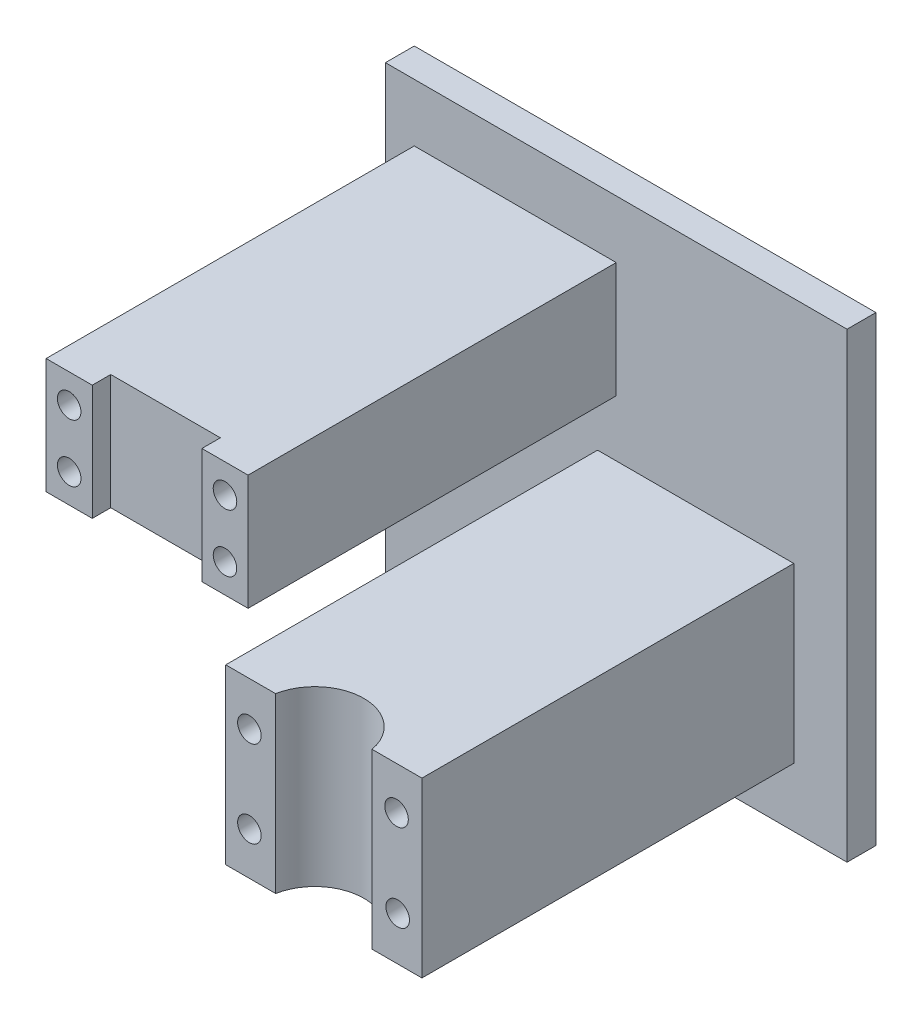
ISO-10303-21;
HEADER;
FILE_DESCRIPTION(('STEP AP214'),'2;1');
FILE_NAME('part.step','',(''),(''),'','','');
FILE_SCHEMA(('AUTOMOTIVE_DESIGN { 1 0 10303 214 1 1 1 1 }'));
ENDSEC;
DATA;
#1=APPLICATION_CONTEXT('core data for automotive mechanical design processes');
#2=APPLICATION_PROTOCOL_DEFINITION('international standard','automotive_design',2000,#1);
#3=PRODUCT_CONTEXT('',#1,'mechanical');
#4=PRODUCT('Part','Part','',(#3));
#5=PRODUCT_RELATED_PRODUCT_CATEGORY('part','',(#4));
#6=PRODUCT_DEFINITION_FORMATION('','',#4);
#7=PRODUCT_DEFINITION_CONTEXT('part definition',#1,'design');
#8=PRODUCT_DEFINITION('design','',#6,#7);
#9=PRODUCT_DEFINITION_SHAPE('','',#8);
#10=(LENGTH_UNIT() NAMED_UNIT(*) SI_UNIT(.MILLI.,.METRE.));
#11=(NAMED_UNIT(*) PLANE_ANGLE_UNIT() SI_UNIT($,.RADIAN.));
#12=(NAMED_UNIT(*) SI_UNIT($,.STERADIAN.) SOLID_ANGLE_UNIT());
#13=UNCERTAINTY_MEASURE_WITH_UNIT(LENGTH_MEASURE(1.E-05),#10,'distance_accuracy_value','');
#14=(GEOMETRIC_REPRESENTATION_CONTEXT(3) GLOBAL_UNCERTAINTY_ASSIGNED_CONTEXT((#13)) GLOBAL_UNIT_ASSIGNED_CONTEXT((#10,
#11,#12)) REPRESENTATION_CONTEXT('',''));
#15=CARTESIAN_POINT('',(0.,0.,0.));
#16=DIRECTION('',(0.,0.,1.));
#17=DIRECTION('',(1.,0.,0.));
#18=AXIS2_PLACEMENT_3D('',#15,#16,#17);
#19=CARTESIAN_POINT('',(0.,0.,6.35));
#20=DIRECTION('',(0.,0.,1.));
#21=DIRECTION('',(1.,0.,0.));
#22=AXIS2_PLACEMENT_3D('',#19,#20,#21);
#23=PLANE('',#22);
#24=DIRECTION('',(0.,1.,0.));
#25=VECTOR('',#24,1.);
#26=CARTESIAN_POINT('',(0.,0.,6.35));
#27=LINE('',#26,#25);
#28=CARTESIAN_POINT('',(0.,0.,6.35));
#29=VERTEX_POINT('',#28);
#30=CARTESIAN_POINT('',(0.,101.6,6.35));
#31=VERTEX_POINT('',#30);
#32=EDGE_CURVE('E212',#29,#31,#27,.T.);
#33=ORIENTED_EDGE('',*,*,#32,.T.);
#34=DIRECTION('',(-1.,0.,0.));
#35=VECTOR('',#34,1.);
#36=CARTESIAN_POINT('',(0.,101.6,6.35));
#37=LINE('',#36,#35);
#38=CARTESIAN_POINT('',(-101.6,101.6,6.35));
#39=VERTEX_POINT('',#38);
#40=EDGE_CURVE('E215',#31,#39,#37,.T.);
#41=ORIENTED_EDGE('',*,*,#40,.T.);
#42=DIRECTION('',(0.,-1.,0.));
#43=VECTOR('',#42,1.);
#44=CARTESIAN_POINT('',(-101.6,0.,6.35));
#45=LINE('',#44,#43);
#46=CARTESIAN_POINT('',(-101.6,0.,6.35));
#47=VERTEX_POINT('',#46);
#48=EDGE_CURVE('E218',#39,#47,#45,.T.);
#49=ORIENTED_EDGE('',*,*,#48,.T.);
#50=DIRECTION('',(1.,0.,0.));
#51=VECTOR('',#50,1.);
#52=CARTESIAN_POINT('',(0.,0.,6.35));
#53=LINE('',#52,#51);
#54=EDGE_CURVE('E220',#47,#29,#53,.T.);
#55=ORIENTED_EDGE('',*,*,#54,.T.);
#56=EDGE_LOOP('',(#33,#41,#49,#55));
#57=FACE_BOUND('',#56,.T.);
#58=DIRECTION('',(1.,0.,0.));
#59=VECTOR('',#58,1.);
#60=CARTESIAN_POINT('',(-95.25,63.5,6.35));
#61=LINE('',#60,#59);
#62=CARTESIAN_POINT('',(-95.25,63.5,6.35));
#63=VERTEX_POINT('',#62);
#64=CARTESIAN_POINT('',(-50.8,63.5,6.35));
#65=VERTEX_POINT('',#64);
#66=EDGE_CURVE('E354',#63,#65,#61,.T.);
#67=ORIENTED_EDGE('',*,*,#66,.F.);
#68=DIRECTION('',(0.,-1.,0.));
#69=VECTOR('',#68,1.);
#70=CARTESIAN_POINT('',(-95.25,88.9,6.35));
#71=LINE('',#70,#69);
#72=CARTESIAN_POINT('',(-95.25,88.9,6.35));
#73=VERTEX_POINT('',#72);
#74=EDGE_CURVE('E200',#73,#63,#71,.T.);
#75=ORIENTED_EDGE('',*,*,#74,.F.);
#76=DIRECTION('',(-1.,0.,0.));
#77=VECTOR('',#76,1.);
#78=CARTESIAN_POINT('',(-95.25,88.9,6.35));
#79=LINE('',#78,#77);
#80=CARTESIAN_POINT('',(-50.8,88.9,6.35));
#81=VERTEX_POINT('',#80);
#82=EDGE_CURVE('E359',#81,#73,#79,.T.);
#83=ORIENTED_EDGE('',*,*,#82,.F.);
#84=DIRECTION('',(0.,1.,0.));
#85=VECTOR('',#84,1.);
#86=CARTESIAN_POINT('',(-50.8,88.9,6.35));
#87=LINE('',#86,#85);
#88=EDGE_CURVE('E356',#65,#81,#87,.T.);
#89=ORIENTED_EDGE('',*,*,#88,.F.);
#90=EDGE_LOOP('',(#67,#75,#83,#89));
#91=FACE_BOUND('',#90,.T.);
#92=DIRECTION('',(1.,0.,0.));
#93=VECTOR('',#92,1.);
#94=CARTESIAN_POINT('',(-54.9059993594507,12.991507512595,6.35));
#95=LINE('',#94,#93);
#96=CARTESIAN_POINT('',(-54.9059993594507,12.991507512595,6.35));
#97=VERTEX_POINT('',#96);
#98=CARTESIAN_POINT('',(-11.7259993594507,12.991507512595,6.35));
#99=VERTEX_POINT('',#98);
#100=EDGE_CURVE('E328',#97,#99,#95,.T.);
#101=ORIENTED_EDGE('',*,*,#100,.F.);
#102=DIRECTION('',(0.,-1.,0.));
#103=VECTOR('',#102,1.);
#104=CARTESIAN_POINT('',(-54.9059993594507,12.991507512595,6.35));
#105=LINE('',#104,#103);
#106=CARTESIAN_POINT('',(-54.9059993594507,51.091507512595,6.35));
#107=VERTEX_POINT('',#106);
#108=EDGE_CURVE('E325',#107,#97,#105,.T.);
#109=ORIENTED_EDGE('',*,*,#108,.F.);
#110=DIRECTION('',(-1.,0.,0.));
#111=VECTOR('',#110,1.);
#112=CARTESIAN_POINT('',(-54.9059993594507,51.091507512595,6.35));
#113=LINE('',#112,#111);
#114=CARTESIAN_POINT('',(-11.7259993594507,51.091507512595,6.35));
#115=VERTEX_POINT('',#114);
#116=EDGE_CURVE('E334',#115,#107,#113,.T.);
#117=ORIENTED_EDGE('',*,*,#116,.F.);
#118=DIRECTION('',(0.,1.,0.));
#119=VECTOR('',#118,1.);
#120=CARTESIAN_POINT('',(-11.7259993594507,12.991507512595,6.35));
#121=LINE('',#120,#119);
#122=EDGE_CURVE('E331',#99,#115,#121,.T.);
#123=ORIENTED_EDGE('',*,*,#122,.F.);
#124=EDGE_LOOP('',(#101,#109,#117,#123));
#125=FACE_BOUND('',#124,.T.);
#126=ADVANCED_FACE('F32',(#57,#91,#125),#23,.T.);
#127=CARTESIAN_POINT('',(0.,0.,6.35));
#128=DIRECTION('',(-1.,0.,0.));
#129=DIRECTION('',(0.,0.,1.));
#130=AXIS2_PLACEMENT_3D('',#127,#128,#129);
#131=PLANE('',#130);
#132=DIRECTION('',(0.,1.,0.));
#133=VECTOR('',#132,1.);
#134=CARTESIAN_POINT('',(0.,0.,0.));
#135=LINE('',#134,#133);
#136=CARTESIAN_POINT('',(0.,0.,0.));
#137=VERTEX_POINT('',#136);
#138=CARTESIAN_POINT('',(0.,101.6,0.));
#139=VERTEX_POINT('',#138);
#140=EDGE_CURVE('E202',#137,#139,#135,.T.);
#141=ORIENTED_EDGE('',*,*,#140,.T.);
#142=DIRECTION('',(0.,0.,-1.));
#143=VECTOR('',#142,1.);
#144=CARTESIAN_POINT('',(0.,101.6,6.35));
#145=LINE('',#144,#143);
#146=EDGE_CURVE('E235',#31,#139,#145,.T.);
#147=ORIENTED_EDGE('',*,*,#146,.F.);
#148=ORIENTED_EDGE('',*,*,#32,.F.);
#149=DIRECTION('',(0.,0.,-1.));
#150=VECTOR('',#149,1.);
#151=CARTESIAN_POINT('',(0.,0.,6.35));
#152=LINE('',#151,#150);
#153=EDGE_CURVE('E221',#29,#137,#152,.T.);
#154=ORIENTED_EDGE('',*,*,#153,.T.);
#155=EDGE_LOOP('',(#141,#147,#148,#154));
#156=FACE_BOUND('',#155,.T.);
#157=ADVANCED_FACE('F34',(#156),#131,.F.);
#158=CARTESIAN_POINT('',(0.,101.6,6.35));
#159=DIRECTION('',(0.,-1.,0.));
#160=DIRECTION('',(1.,0.,0.));
#161=AXIS2_PLACEMENT_3D('',#158,#159,#160);
#162=PLANE('',#161);
#163=DIRECTION('',(-1.,0.,0.));
#164=VECTOR('',#163,1.);
#165=CARTESIAN_POINT('',(0.,101.6,0.));
#166=LINE('',#165,#164);
#167=CARTESIAN_POINT('',(-101.6,101.6,0.));
#168=VERTEX_POINT('',#167);
#169=EDGE_CURVE('E206',#139,#168,#166,.T.);
#170=ORIENTED_EDGE('',*,*,#169,.T.);
#171=DIRECTION('',(0.,0.,-1.));
#172=VECTOR('',#171,1.);
#173=CARTESIAN_POINT('',(-101.6,101.6,6.35));
#174=LINE('',#173,#172);
#175=EDGE_CURVE('E232',#39,#168,#174,.T.);
#176=ORIENTED_EDGE('',*,*,#175,.F.);
#177=ORIENTED_EDGE('',*,*,#40,.F.);
#178=ORIENTED_EDGE('',*,*,#146,.T.);
#179=EDGE_LOOP('',(#170,#176,#177,#178));
#180=FACE_BOUND('',#179,.T.);
#181=ADVANCED_FACE('F416',(#180),#162,.F.);
#182=CARTESIAN_POINT('',(-101.6,0.,6.35));
#183=DIRECTION('',(1.,0.,0.));
#184=DIRECTION('',(0.,0.,-1.));
#185=AXIS2_PLACEMENT_3D('',#182,#183,#184);
#186=PLANE('',#185);
#187=DIRECTION('',(0.,-1.,0.));
#188=VECTOR('',#187,1.);
#189=CARTESIAN_POINT('',(-101.6,0.,0.));
#190=LINE('',#189,#188);
#191=CARTESIAN_POINT('',(-101.6,0.,0.));
#192=VERTEX_POINT('',#191);
#193=EDGE_CURVE('E224',#168,#192,#190,.T.);
#194=ORIENTED_EDGE('',*,*,#193,.T.);
#195=DIRECTION('',(0.,0.,-1.));
#196=VECTOR('',#195,1.);
#197=CARTESIAN_POINT('',(-101.6,0.,6.35));
#198=LINE('',#197,#196);
#199=EDGE_CURVE('E229',#47,#192,#198,.T.);
#200=ORIENTED_EDGE('',*,*,#199,.F.);
#201=ORIENTED_EDGE('',*,*,#48,.F.);
#202=ORIENTED_EDGE('',*,*,#175,.T.);
#203=EDGE_LOOP('',(#194,#200,#201,#202));
#204=FACE_BOUND('',#203,.T.);
#205=ADVANCED_FACE('F428',(#204),#186,.F.);
#206=CARTESIAN_POINT('',(0.,0.,6.35));
#207=DIRECTION('',(0.,1.,0.));
#208=DIRECTION('',(-1.,0.,0.));
#209=AXIS2_PLACEMENT_3D('',#206,#207,#208);
#210=PLANE('',#209);
#211=DIRECTION('',(1.,0.,0.));
#212=VECTOR('',#211,1.);
#213=CARTESIAN_POINT('',(0.,0.,0.));
#214=LINE('',#213,#212);
#215=EDGE_CURVE('E216',#192,#137,#214,.T.);
#216=ORIENTED_EDGE('',*,*,#215,.T.);
#217=ORIENTED_EDGE('',*,*,#153,.F.);
#218=ORIENTED_EDGE('',*,*,#54,.F.);
#219=ORIENTED_EDGE('',*,*,#199,.T.);
#220=EDGE_LOOP('',(#216,#217,#218,#219));
#221=FACE_BOUND('',#220,.T.);
#222=ADVANCED_FACE('F424',(#221),#210,.F.);
#223=CARTESIAN_POINT('',(0.,0.,0.));
#224=DIRECTION('',(0.,0.,1.));
#225=DIRECTION('',(1.,0.,0.));
#226=AXIS2_PLACEMENT_3D('',#223,#224,#225);
#227=PLANE('',#226);
#228=ORIENTED_EDGE('',*,*,#140,.F.);
#229=ORIENTED_EDGE('',*,*,#215,.F.);
#230=ORIENTED_EDGE('',*,*,#193,.F.);
#231=ORIENTED_EDGE('',*,*,#169,.F.);
#232=EDGE_LOOP('',(#228,#229,#230,#231));
#233=FACE_BOUND('',#232,.T.);
#234=ADVANCED_FACE('F421',(#233),#227,.F.);
#235=CARTESIAN_POINT('',(-95.25,88.9,107.95));
#236=DIRECTION('',(1.,0.,0.));
#237=DIRECTION('',(0.,0.,-1.));
#238=AXIS2_PLACEMENT_3D('',#235,#236,#237);
#239=PLANE('',#238);
#240=DIRECTION('',(0.,0.,-1.));
#241=VECTOR('',#240,1.);
#242=CARTESIAN_POINT('',(-95.25,63.5,107.95));
#243=LINE('',#242,#241);
#244=CARTESIAN_POINT('',(-95.25,63.5,87.376));
#245=VERTEX_POINT('',#244);
#246=EDGE_CURVE('E192',#245,#63,#243,.T.);
#247=ORIENTED_EDGE('',*,*,#246,.F.);
#248=DIRECTION('',(0.,1.,0.));
#249=VECTOR('',#248,1.);
#250=CARTESIAN_POINT('',(-95.25,-0.00100000000004263,87.376));
#251=LINE('',#250,#249);
#252=CARTESIAN_POINT('',(-95.25,88.9,87.376));
#253=VERTEX_POINT('',#252);
#254=EDGE_CURVE('E178',#245,#253,#251,.T.);
#255=ORIENTED_EDGE('',*,*,#254,.T.);
#256=DIRECTION('',(0.,0.,-1.));
#257=VECTOR('',#256,1.);
#258=CARTESIAN_POINT('',(-95.25,88.9,107.95));
#259=LINE('',#258,#257);
#260=EDGE_CURVE('E362',#253,#73,#259,.T.);
#261=ORIENTED_EDGE('',*,*,#260,.T.);
#262=ORIENTED_EDGE('',*,*,#74,.T.);
#263=EDGE_LOOP('',(#247,#255,#261,#262));
#264=FACE_BOUND('',#263,.T.);
#265=ADVANCED_FACE('F198',(#264),#239,.F.);
#266=CARTESIAN_POINT('',(-95.25,63.5,107.95));
#267=DIRECTION('',(0.,1.,0.));
#268=DIRECTION('',(0.,0.,1.));
#269=AXIS2_PLACEMENT_3D('',#266,#267,#268);
#270=PLANE('',#269);
#271=DIRECTION('',(0.,0.,-1.));
#272=VECTOR('',#271,1.);
#273=CARTESIAN_POINT('',(-85.09,63.5,95.25));
#274=LINE('',#273,#272);
#275=CARTESIAN_POINT('',(-85.09,63.5,87.376));
#276=VERTEX_POINT('',#275);
#277=CARTESIAN_POINT('',(-85.09,63.5,83.312));
#278=VERTEX_POINT('',#277);
#279=EDGE_CURVE('E195',#276,#278,#274,.T.);
#280=ORIENTED_EDGE('',*,*,#279,.F.);
#281=DIRECTION('',(1.,0.,0.));
#282=VECTOR('',#281,1.);
#283=CARTESIAN_POINT('',(-50.8,63.5,87.376));
#284=LINE('',#283,#282);
#285=EDGE_CURVE('E47',#245,#276,#284,.T.);
#286=ORIENTED_EDGE('',*,*,#285,.F.);
#287=ORIENTED_EDGE('',*,*,#246,.T.);
#288=ORIENTED_EDGE('',*,*,#66,.T.);
#289=DIRECTION('',(0.,0.,-1.));
#290=VECTOR('',#289,1.);
#291=CARTESIAN_POINT('',(-50.8,63.5,107.95));
#292=LINE('',#291,#290);
#293=CARTESIAN_POINT('',(-50.8,63.5,87.376));
#294=VERTEX_POINT('',#293);
#295=EDGE_CURVE('E203',#294,#65,#292,.T.);
#296=ORIENTED_EDGE('',*,*,#295,.F.);
#297=DIRECTION('',(1.,0.,0.));
#298=VECTOR('',#297,1.);
#299=CARTESIAN_POINT('',(-50.8,63.5,87.376));
#300=LINE('',#299,#298);
#301=CARTESIAN_POINT('',(-60.96,63.5,87.376));
#302=VERTEX_POINT('',#301);
#303=EDGE_CURVE('E255',#302,#294,#300,.T.);
#304=ORIENTED_EDGE('',*,*,#303,.F.);
#305=DIRECTION('',(0.,0.,1.));
#306=VECTOR('',#305,1.);
#307=CARTESIAN_POINT('',(-60.96,63.5,95.25));
#308=LINE('',#307,#306);
#309=CARTESIAN_POINT('',(-60.96,63.5,83.312));
#310=VERTEX_POINT('',#309);
#311=EDGE_CURVE('E253',#310,#302,#308,.T.);
#312=ORIENTED_EDGE('',*,*,#311,.F.);
#313=DIRECTION('',(1.,0.,0.));
#314=VECTOR('',#313,1.);
#315=CARTESIAN_POINT('',(-85.09,63.5,83.312));
#316=LINE('',#315,#314);
#317=EDGE_CURVE('E346',#278,#310,#316,.T.);
#318=ORIENTED_EDGE('',*,*,#317,.F.);
#319=EDGE_LOOP('',(#280,#286,#287,#288,#296,#304,#312,#318));
#320=FACE_BOUND('',#319,.T.);
#321=ADVANCED_FACE('F190',(#320),#270,.F.);
#322=CARTESIAN_POINT('',(-50.8,88.9,107.95));
#323=DIRECTION('',(-1.,0.,0.));
#324=DIRECTION('',(0.,0.,1.));
#325=AXIS2_PLACEMENT_3D('',#322,#323,#324);
#326=PLANE('',#325);
#327=DIRECTION('',(0.,0.,-1.));
#328=VECTOR('',#327,1.);
#329=CARTESIAN_POINT('',(-50.8,88.9,107.95));
#330=LINE('',#329,#328);
#331=CARTESIAN_POINT('',(-50.8,88.9,87.376));
#332=VERTEX_POINT('',#331);
#333=EDGE_CURVE('E208',#332,#81,#330,.T.);
#334=ORIENTED_EDGE('',*,*,#333,.F.);
#335=DIRECTION('',(0.,1.,0.));
#336=VECTOR('',#335,1.);
#337=CARTESIAN_POINT('',(-50.8,-0.00100000000002876,87.376));
#338=LINE('',#337,#336);
#339=EDGE_CURVE('E262',#294,#332,#338,.T.);
#340=ORIENTED_EDGE('',*,*,#339,.F.);
#341=ORIENTED_EDGE('',*,*,#295,.T.);
#342=ORIENTED_EDGE('',*,*,#88,.T.);
#343=EDGE_LOOP('',(#334,#340,#341,#342));
#344=FACE_BOUND('',#343,.T.);
#345=ADVANCED_FACE('F367',(#344),#326,.F.);
#346=CARTESIAN_POINT('',(-95.25,88.9,107.95));
#347=DIRECTION('',(0.,-1.,0.));
#348=DIRECTION('',(1.,0.,0.));
#349=AXIS2_PLACEMENT_3D('',#346,#347,#348);
#350=PLANE('',#349);
#351=ORIENTED_EDGE('',*,*,#260,.F.);
#352=DIRECTION('',(-1.,0.,0.));
#353=VECTOR('',#352,1.);
#354=CARTESIAN_POINT('',(-50.8,88.9,87.376));
#355=LINE('',#354,#353);
#356=CARTESIAN_POINT('',(-85.09,88.9,87.376));
#357=VERTEX_POINT('',#356);
#358=EDGE_CURVE('E182',#357,#253,#355,.T.);
#359=ORIENTED_EDGE('',*,*,#358,.F.);
#360=DIRECTION('',(0.,0.,-1.));
#361=VECTOR('',#360,1.);
#362=CARTESIAN_POINT('',(-85.09,88.9,107.95));
#363=LINE('',#362,#361);
#364=CARTESIAN_POINT('',(-85.09,88.9,83.312));
#365=VERTEX_POINT('',#364);
#366=EDGE_CURVE('E11',#357,#365,#363,.T.);
#367=ORIENTED_EDGE('',*,*,#366,.T.);
#368=DIRECTION('',(1.,0.,0.));
#369=VECTOR('',#368,1.);
#370=CARTESIAN_POINT('',(-95.25,88.9,83.312));
#371=LINE('',#370,#369);
#372=CARTESIAN_POINT('',(-60.96,88.9,83.312));
#373=VERTEX_POINT('',#372);
#374=EDGE_CURVE('E238',#365,#373,#371,.T.);
#375=ORIENTED_EDGE('',*,*,#374,.T.);
#376=DIRECTION('',(0.,0.,1.));
#377=VECTOR('',#376,1.);
#378=CARTESIAN_POINT('',(-60.96,88.9,107.95));
#379=LINE('',#378,#377);
#380=CARTESIAN_POINT('',(-60.96,88.9,87.376));
#381=VERTEX_POINT('',#380);
#382=EDGE_CURVE('E40',#373,#381,#379,.T.);
#383=ORIENTED_EDGE('',*,*,#382,.T.);
#384=DIRECTION('',(-1.,0.,0.));
#385=VECTOR('',#384,1.);
#386=CARTESIAN_POINT('',(-50.8,88.9,87.376));
#387=LINE('',#386,#385);
#388=EDGE_CURVE('E55',#332,#381,#387,.T.);
#389=ORIENTED_EDGE('',*,*,#388,.F.);
#390=ORIENTED_EDGE('',*,*,#333,.T.);
#391=ORIENTED_EDGE('',*,*,#82,.T.);
#392=EDGE_LOOP('',(#351,#359,#367,#375,#383,#389,#390,#391));
#393=FACE_BOUND('',#392,.T.);
#394=ADVANCED_FACE('F243',(#393),#350,.F.);
#395=CARTESIAN_POINT('',(-85.09,165.1,95.25));
#396=DIRECTION('',(-1.,0.,0.));
#397=DIRECTION('',(0.,0.,1.));
#398=AXIS2_PLACEMENT_3D('',#395,#396,#397);
#399=PLANE('',#398);
#400=ORIENTED_EDGE('',*,*,#366,.F.);
#401=DIRECTION('',(0.,1.,0.));
#402=VECTOR('',#401,1.);
#403=CARTESIAN_POINT('',(-85.09,-0.00100000000002876,87.376));
#404=LINE('',#403,#402);
#405=EDGE_CURVE('E196',#276,#357,#404,.T.);
#406=ORIENTED_EDGE('',*,*,#405,.F.);
#407=ORIENTED_EDGE('',*,*,#279,.T.);
#408=DIRECTION('',(0.,-1.,0.));
#409=VECTOR('',#408,1.);
#410=CARTESIAN_POINT('',(-85.09,165.1,83.312));
#411=LINE('',#410,#409);
#412=EDGE_CURVE('E349',#365,#278,#411,.T.);
#413=ORIENTED_EDGE('',*,*,#412,.F.);
#414=EDGE_LOOP('',(#400,#406,#407,#413));
#415=FACE_BOUND('',#414,.T.);
#416=ADVANCED_FACE('F484',(#415),#399,.F.);
#417=CARTESIAN_POINT('',(-60.96,165.1,95.25));
#418=DIRECTION('',(1.,0.,0.));
#419=DIRECTION('',(0.,0.,-1.));
#420=AXIS2_PLACEMENT_3D('',#417,#418,#419);
#421=PLANE('',#420);
#422=ORIENTED_EDGE('',*,*,#311,.T.);
#423=DIRECTION('',(0.,-1.,0.));
#424=VECTOR('',#423,1.);
#425=CARTESIAN_POINT('',(-60.96,-0.00100000000002876,87.376));
#426=LINE('',#425,#424);
#427=EDGE_CURVE('E251',#381,#302,#426,.T.);
#428=ORIENTED_EDGE('',*,*,#427,.F.);
#429=ORIENTED_EDGE('',*,*,#382,.F.);
#430=DIRECTION('',(0.,-1.,0.));
#431=VECTOR('',#430,1.);
#432=CARTESIAN_POINT('',(-60.96,165.1,83.312));
#433=LINE('',#432,#431);
#434=EDGE_CURVE('E249',#373,#310,#433,.T.);
#435=ORIENTED_EDGE('',*,*,#434,.T.);
#436=EDGE_LOOP('',(#422,#428,#429,#435));
#437=FACE_BOUND('',#436,.T.);
#438=ADVANCED_FACE('F248',(#437),#421,.F.);
#439=CARTESIAN_POINT('',(-85.09,165.1,83.312));
#440=DIRECTION('',(0.,0.,-1.));
#441=DIRECTION('',(-1.,0.,0.));
#442=AXIS2_PLACEMENT_3D('',#439,#440,#441);
#443=PLANE('',#442);
#444=ORIENTED_EDGE('',*,*,#412,.T.);
#445=ORIENTED_EDGE('',*,*,#317,.T.);
#446=ORIENTED_EDGE('',*,*,#434,.F.);
#447=ORIENTED_EDGE('',*,*,#374,.F.);
#448=EDGE_LOOP('',(#444,#445,#446,#447));
#449=FACE_BOUND('',#448,.T.);
#450=ADVANCED_FACE('F498',(#449),#443,.F.);
#451=CARTESIAN_POINT('',(-54.9059993594507,12.991507512595,107.95));
#452=DIRECTION('',(1.,0.,0.));
#453=DIRECTION('',(0.,0.,-1.));
#454=AXIS2_PLACEMENT_3D('',#451,#452,#453);
#455=PLANE('',#454);
#456=DIRECTION('',(0.,0.,-1.));
#457=VECTOR('',#456,1.);
#458=CARTESIAN_POINT('',(-54.9059993594507,12.991507512595,107.95));
#459=LINE('',#458,#457);
#460=CARTESIAN_POINT('',(-54.9059993594507,12.991507512595,88.1851260235543));
#461=VERTEX_POINT('',#460);
#462=EDGE_CURVE('E343',#461,#97,#459,.T.);
#463=ORIENTED_EDGE('',*,*,#462,.F.);
#464=DIRECTION('',(0.,-1.,0.));
#465=VECTOR('',#464,1.);
#466=CARTESIAN_POINT('',(-54.9059993594507,101.601,88.1851260235543));
#467=LINE('',#466,#465);
#468=CARTESIAN_POINT('',(-54.9059993594507,51.091507512595,88.1851260235543));
#469=VERTEX_POINT('',#468);
#470=EDGE_CURVE('E287',#469,#461,#467,.T.);
#471=ORIENTED_EDGE('',*,*,#470,.F.);
#472=DIRECTION('',(0.,0.,-1.));
#473=VECTOR('',#472,1.);
#474=CARTESIAN_POINT('',(-54.9059993594507,51.091507512595,107.95));
#475=LINE('',#474,#473);
#476=EDGE_CURVE('E337',#469,#107,#475,.T.);
#477=ORIENTED_EDGE('',*,*,#476,.T.);
#478=ORIENTED_EDGE('',*,*,#108,.T.);
#479=EDGE_LOOP('',(#463,#471,#477,#478));
#480=FACE_BOUND('',#479,.T.);
#481=ADVANCED_FACE('F505',(#480),#455,.F.);
#482=CARTESIAN_POINT('',(-54.9059993594507,12.991507512595,107.95));
#483=DIRECTION('',(0.,1.,0.));
#484=DIRECTION('',(0.,0.,1.));
#485=AXIS2_PLACEMENT_3D('',#482,#483,#484);
#486=PLANE('',#485);
#487=DIRECTION('',(0.,0.,-1.));
#488=VECTOR('',#487,1.);
#489=CARTESIAN_POINT('',(-11.7259993594507,12.991507512595,107.95));
#490=LINE('',#489,#488);
#491=CARTESIAN_POINT('',(-11.7259993594507,12.991507512595,88.1851260235543));
#492=VERTEX_POINT('',#491);
#493=EDGE_CURVE('E341',#492,#99,#490,.T.);
#494=ORIENTED_EDGE('',*,*,#493,.F.);
#495=DIRECTION('',(1.,0.,0.));
#496=VECTOR('',#495,1.);
#497=CARTESIAN_POINT('',(-54.9059993594507,12.991507512595,88.1851260235543));
#498=LINE('',#497,#496);
#499=CARTESIAN_POINT('',(-22.7050474559866,12.991507512595,88.1851260235543));
#500=VERTEX_POINT('',#499);
#501=EDGE_CURVE('E267',#500,#492,#498,.T.);
#502=ORIENTED_EDGE('',*,*,#501,.F.);
#503=CARTESIAN_POINT('',(-33.3159993594507,12.991507512595,90.17));
#504=DIRECTION('',(0.,1.,0.));
#505=DIRECTION('',(0.,0.,1.));
#506=AXIS2_PLACEMENT_3D('',#503,#504,#505);
#507=CIRCLE('',#506,10.795);
#508=CARTESIAN_POINT('',(-43.9269512629147,12.991507512595,88.1851260235543));
#509=VERTEX_POINT('',#508);
#510=EDGE_CURVE('E322',#500,#509,#507,.T.);
#511=ORIENTED_EDGE('',*,*,#510,.T.);
#512=DIRECTION('',(1.,0.,0.));
#513=VECTOR('',#512,1.);
#514=CARTESIAN_POINT('',(-54.9059993594507,12.991507512595,88.1851260235543));
#515=LINE('',#514,#513);
#516=EDGE_CURVE('E293',#461,#509,#515,.T.);
#517=ORIENTED_EDGE('',*,*,#516,.F.);
#518=ORIENTED_EDGE('',*,*,#462,.T.);
#519=ORIENTED_EDGE('',*,*,#100,.T.);
#520=EDGE_LOOP('',(#494,#502,#511,#517,#518,#519));
#521=FACE_BOUND('',#520,.T.);
#522=ADVANCED_FACE('F513',(#521),#486,.F.);
#523=CARTESIAN_POINT('',(-11.7259993594507,12.991507512595,107.95));
#524=DIRECTION('',(-1.,0.,0.));
#525=DIRECTION('',(0.,0.,1.));
#526=AXIS2_PLACEMENT_3D('',#523,#524,#525);
#527=PLANE('',#526);
#528=DIRECTION('',(0.,0.,-1.));
#529=VECTOR('',#528,1.);
#530=CARTESIAN_POINT('',(-11.7259993594507,51.091507512595,107.95));
#531=LINE('',#530,#529);
#532=CARTESIAN_POINT('',(-11.7259993594507,51.091507512595,88.1851260235543));
#533=VERTEX_POINT('',#532);
#534=EDGE_CURVE('E339',#533,#115,#531,.T.);
#535=ORIENTED_EDGE('',*,*,#534,.F.);
#536=DIRECTION('',(0.,-1.,0.));
#537=VECTOR('',#536,1.);
#538=CARTESIAN_POINT('',(-11.7259993594507,101.601,88.1851260235543));
#539=LINE('',#538,#537);
#540=EDGE_CURVE('E276',#533,#492,#539,.T.);
#541=ORIENTED_EDGE('',*,*,#540,.T.);
#542=ORIENTED_EDGE('',*,*,#493,.T.);
#543=ORIENTED_EDGE('',*,*,#122,.T.);
#544=EDGE_LOOP('',(#535,#541,#542,#543));
#545=FACE_BOUND('',#544,.T.);
#546=ADVANCED_FACE('F522',(#545),#527,.F.);
#547=CARTESIAN_POINT('',(-54.9059993594507,51.091507512595,107.95));
#548=DIRECTION('',(0.,-1.,0.));
#549=DIRECTION('',(0.,0.,-1.));
#550=AXIS2_PLACEMENT_3D('',#547,#548,#549);
#551=PLANE('',#550);
#552=CARTESIAN_POINT('',(-33.3159993594507,51.091507512595,90.17));
#553=DIRECTION('',(0.,1.,0.));
#554=DIRECTION('',(0.,0.,1.));
#555=AXIS2_PLACEMENT_3D('',#552,#553,#554);
#556=CIRCLE('',#555,10.795);
#557=CARTESIAN_POINT('',(-22.7050474559866,51.091507512595,88.1851260235543));
#558=VERTEX_POINT('',#557);
#559=CARTESIAN_POINT('',(-43.9269512629147,51.091507512595,88.1851260235543));
#560=VERTEX_POINT('',#559);
#561=EDGE_CURVE('E319',#558,#560,#556,.T.);
#562=ORIENTED_EDGE('',*,*,#561,.F.);
#563=DIRECTION('',(-1.,0.,0.));
#564=VECTOR('',#563,1.);
#565=CARTESIAN_POINT('',(-54.9059993594507,51.091507512595,88.1851260235543));
#566=LINE('',#565,#564);
#567=EDGE_CURVE('E265',#533,#558,#566,.T.);
#568=ORIENTED_EDGE('',*,*,#567,.F.);
#569=ORIENTED_EDGE('',*,*,#534,.T.);
#570=ORIENTED_EDGE('',*,*,#116,.T.);
#571=ORIENTED_EDGE('',*,*,#476,.F.);
#572=DIRECTION('',(-1.,0.,0.));
#573=VECTOR('',#572,1.);
#574=CARTESIAN_POINT('',(-54.9059993594507,51.091507512595,88.1851260235543));
#575=LINE('',#574,#573);
#576=EDGE_CURVE('E290',#560,#469,#575,.T.);
#577=ORIENTED_EDGE('',*,*,#576,.F.);
#578=EDGE_LOOP('',(#562,#568,#569,#570,#571,#577));
#579=FACE_BOUND('',#578,.T.);
#580=ADVANCED_FACE('F530',(#579),#551,.F.);
#581=CARTESIAN_POINT('',(-33.3159993594507,0.,90.17));
#582=DIRECTION('',(0.,1.,0.));
#583=DIRECTION('',(0.,0.,1.));
#584=AXIS2_PLACEMENT_3D('',#581,#582,#583);
#585=CYLINDRICAL_SURFACE('',#584,10.795);
#586=ORIENTED_EDGE('',*,*,#510,.F.);
#587=DIRECTION('',(0.,1.,0.));
#588=VECTOR('',#587,1.);
#589=CARTESIAN_POINT('',(-22.7050474559866,0.,88.1851260235543));
#590=LINE('',#589,#588);
#591=EDGE_CURVE('E268',#558,#500,#590,.F.);
#592=ORIENTED_EDGE('',*,*,#591,.F.);
#593=ORIENTED_EDGE('',*,*,#561,.T.);
#594=DIRECTION('',(0.,1.,0.));
#595=VECTOR('',#594,1.);
#596=CARTESIAN_POINT('',(-43.9269512629147,0.,88.1851260235543));
#597=LINE('',#596,#595);
#598=EDGE_CURVE('E288',#509,#560,#597,.T.);
#599=ORIENTED_EDGE('',*,*,#598,.F.);
#600=EDGE_LOOP('',(#586,#592,#593,#599));
#601=FACE_BOUND('',#600,.T.);
#602=ADVANCED_FACE('F538',(#601),#585,.F.);
#603=CARTESIAN_POINT('',(-54.9059993594507,101.601,88.1851260235543));
#604=DIRECTION('',(0.,0.,-1.));
#605=DIRECTION('',(-1.,0.,0.));
#606=AXIS2_PLACEMENT_3D('',#603,#604,#605);
#607=PLANE('',#606);
#608=ORIENTED_EDGE('',*,*,#567,.T.);
#609=ORIENTED_EDGE('',*,*,#591,.T.);
#610=ORIENTED_EDGE('',*,*,#501,.T.);
#611=ORIENTED_EDGE('',*,*,#540,.F.);
#612=EDGE_LOOP('',(#608,#609,#610,#611));
#613=FACE_BOUND('',#612,.T.);
#614=CARTESIAN_POINT('',(-17.3139993594507,41.693507512595,88.1851260235543));
#615=DIRECTION('',(0.,0.,-1.));
#616=DIRECTION('',(-1.,0.,0.));
#617=AXIS2_PLACEMENT_3D('',#614,#615,#616);
#618=CIRCLE('',#617,2.5908);
#619=CARTESIAN_POINT('',(-19.9047993594507,41.693507512595,88.1851260235543));
#620=VERTEX_POINT('',#619);
#621=EDGE_CURVE('E269',#620,#620,#618,.T.);
#622=ORIENTED_EDGE('',*,*,#621,.T.);
#623=EDGE_LOOP('',(#622));
#624=FACE_BOUND('',#623,.T.);
#625=CARTESIAN_POINT('',(-17.0602948638247,22.643507512595,88.1851260235543));
#626=DIRECTION('',(0.,0.,-1.));
#627=DIRECTION('',(-1.,0.,0.));
#628=AXIS2_PLACEMENT_3D('',#625,#626,#627);
#629=CIRCLE('',#628,2.5908);
#630=CARTESIAN_POINT('',(-19.6510948638247,22.643507512595,88.1851260235543));
#631=VERTEX_POINT('',#630);
#632=EDGE_CURVE('E273',#631,#631,#629,.T.);
#633=ORIENTED_EDGE('',*,*,#632,.T.);
#634=EDGE_LOOP('',(#633));
#635=FACE_BOUND('',#634,.T.);
#636=ADVANCED_FACE('F546',(#613,#624,#635),#607,.F.);
#637=CARTESIAN_POINT('',(-17.3139993594507,41.693507512595,77.3901260235543));
#638=DIRECTION('',(0.,0.,1.));
#639=DIRECTION('',(1.,0.,0.));
#640=AXIS2_PLACEMENT_3D('',#637,#638,#639);
#641=CONICAL_SURFACE('',#640,2.5908,1.02974425867666);
#642=CARTESIAN_POINT('',(-17.3139993594507,41.693507512595,75.8334163317777));
#643=VERTEX_POINT('',#642);
#644=VERTEX_LOOP('',#643);
#645=FACE_BOUND('',#644,.T.);
#646=CARTESIAN_POINT('',(-17.3139993594507,41.693507512595,77.3901260235543));
#647=DIRECTION('',(0.,0.,1.));
#648=DIRECTION('',(1.,0.,0.));
#649=AXIS2_PLACEMENT_3D('',#646,#647,#648);
#650=CIRCLE('',#649,2.5908);
#651=CARTESIAN_POINT('',(-14.7231993594507,41.693507512595,77.3901260235543));
#652=VERTEX_POINT('',#651);
#653=EDGE_CURVE('E310',#652,#652,#650,.T.);
#654=ORIENTED_EDGE('',*,*,#653,.T.);
#655=EDGE_LOOP('',(#654));
#656=FACE_BOUND('',#655,.T.);
#657=ADVANCED_FACE('F554',(#645,#656),#641,.F.);
#658=CARTESIAN_POINT('',(-17.3139993594507,41.693507512595,90.0901260235543));
#659=DIRECTION('',(0.,0.,1.));
#660=DIRECTION('',(1.,0.,0.));
#661=AXIS2_PLACEMENT_3D('',#658,#659,#660);
#662=CYLINDRICAL_SURFACE('',#661,2.5908);
#663=ORIENTED_EDGE('',*,*,#621,.F.);
#664=EDGE_LOOP('',(#663));
#665=FACE_BOUND('',#664,.T.);
#666=ORIENTED_EDGE('',*,*,#653,.F.);
#667=EDGE_LOOP('',(#666));
#668=FACE_BOUND('',#667,.T.);
#669=ADVANCED_FACE('F563',(#665,#668),#662,.F.);
#670=CARTESIAN_POINT('',(-54.9059993594507,101.601,88.1851260235543));
#671=DIRECTION('',(0.,0.,-1.));
#672=DIRECTION('',(-1.,0.,0.));
#673=AXIS2_PLACEMENT_3D('',#670,#671,#672);
#674=PLANE('',#673);
#675=ORIENTED_EDGE('',*,*,#576,.T.);
#676=ORIENTED_EDGE('',*,*,#470,.T.);
#677=ORIENTED_EDGE('',*,*,#516,.T.);
#678=ORIENTED_EDGE('',*,*,#598,.T.);
#679=EDGE_LOOP('',(#675,#676,#677,#678));
#680=FACE_BOUND('',#679,.T.);
#681=CARTESIAN_POINT('',(-49.6987038550766,41.439507512595,88.1851260235543));
#682=DIRECTION('',(0.,0.,-1.));
#683=DIRECTION('',(-1.,0.,0.));
#684=AXIS2_PLACEMENT_3D('',#681,#682,#683);
#685=CIRCLE('',#684,2.5908);
#686=CARTESIAN_POINT('',(-52.2895038550766,41.439507512595,88.1851260235543));
#687=VERTEX_POINT('',#686);
#688=EDGE_CURVE('E284',#687,#687,#685,.T.);
#689=ORIENTED_EDGE('',*,*,#688,.T.);
#690=EDGE_LOOP('',(#689));
#691=FACE_BOUND('',#690,.T.);
#692=CARTESIAN_POINT('',(-49.6987038550766,22.389507512595,88.1851260235543));
#693=DIRECTION('',(0.,0.,-1.));
#694=DIRECTION('',(-1.,0.,0.));
#695=AXIS2_PLACEMENT_3D('',#692,#693,#694);
#696=CIRCLE('',#695,2.5908);
#697=CARTESIAN_POINT('',(-52.2895038550766,22.389507512595,88.1851260235543));
#698=VERTEX_POINT('',#697);
#699=EDGE_CURVE('E280',#698,#698,#696,.T.);
#700=ORIENTED_EDGE('',*,*,#699,.T.);
#701=EDGE_LOOP('',(#700));
#702=FACE_BOUND('',#701,.T.);
#703=ADVANCED_FACE('F572',(#680,#691,#702),#674,.F.);
#704=CARTESIAN_POINT('',(-49.6987038550766,22.389507512595,77.3901260235543));
#705=DIRECTION('',(0.,0.,1.));
#706=DIRECTION('',(1.,0.,0.));
#707=AXIS2_PLACEMENT_3D('',#704,#705,#706);
#708=CONICAL_SURFACE('',#707,2.5908,1.02974425867665);
#709=CARTESIAN_POINT('',(-49.6987038550766,22.389507512595,75.8334163317777));
#710=VERTEX_POINT('',#709);
#711=VERTEX_LOOP('',#710);
#712=FACE_BOUND('',#711,.T.);
#713=CARTESIAN_POINT('',(-49.6987038550766,22.389507512595,77.3901260235543));
#714=DIRECTION('',(0.,0.,1.));
#715=DIRECTION('',(1.,0.,0.));
#716=AXIS2_PLACEMENT_3D('',#713,#714,#715);
#717=CIRCLE('',#716,2.5908);
#718=CARTESIAN_POINT('',(-47.1079038550766,22.389507512595,77.3901260235543));
#719=VERTEX_POINT('',#718);
#720=EDGE_CURVE('E316',#719,#719,#717,.T.);
#721=ORIENTED_EDGE('',*,*,#720,.T.);
#722=EDGE_LOOP('',(#721));
#723=FACE_BOUND('',#722,.T.);
#724=ADVANCED_FACE('F580',(#712,#723),#708,.F.);
#725=CARTESIAN_POINT('',(-49.6987038550766,22.389507512595,90.0901260235543));
#726=DIRECTION('',(0.,0.,1.));
#727=DIRECTION('',(1.,0.,0.));
#728=AXIS2_PLACEMENT_3D('',#725,#726,#727);
#729=CYLINDRICAL_SURFACE('',#728,2.5908);
#730=ORIENTED_EDGE('',*,*,#699,.F.);
#731=EDGE_LOOP('',(#730));
#732=FACE_BOUND('',#731,.T.);
#733=ORIENTED_EDGE('',*,*,#720,.F.);
#734=EDGE_LOOP('',(#733));
#735=FACE_BOUND('',#734,.T.);
#736=ADVANCED_FACE('F589',(#732,#735),#729,.F.);
#737=CARTESIAN_POINT('',(-17.0602948638247,22.643507512595,77.3901260235543));
#738=DIRECTION('',(0.,0.,1.));
#739=DIRECTION('',(1.,0.,0.));
#740=AXIS2_PLACEMENT_3D('',#737,#738,#739);
#741=CONICAL_SURFACE('',#740,2.5908,1.02974425867666);
#742=CARTESIAN_POINT('',(-17.0602948638247,22.643507512595,75.8334163317777));
#743=VERTEX_POINT('',#742);
#744=VERTEX_LOOP('',#743);
#745=FACE_BOUND('',#744,.T.);
#746=CARTESIAN_POINT('',(-17.0602948638247,22.643507512595,77.3901260235543));
#747=DIRECTION('',(0.,0.,1.));
#748=DIRECTION('',(1.,0.,0.));
#749=AXIS2_PLACEMENT_3D('',#746,#747,#748);
#750=CIRCLE('',#749,2.5908);
#751=CARTESIAN_POINT('',(-14.4694948638247,22.643507512595,77.3901260235543));
#752=VERTEX_POINT('',#751);
#753=EDGE_CURVE('E307',#752,#752,#750,.T.);
#754=ORIENTED_EDGE('',*,*,#753,.T.);
#755=EDGE_LOOP('',(#754));
#756=FACE_BOUND('',#755,.T.);
#757=ADVANCED_FACE('F596',(#745,#756),#741,.F.);
#758=CARTESIAN_POINT('',(-17.0602948638247,22.643507512595,90.0901260235543));
#759=DIRECTION('',(0.,0.,1.));
#760=DIRECTION('',(1.,0.,0.));
#761=AXIS2_PLACEMENT_3D('',#758,#759,#760);
#762=CYLINDRICAL_SURFACE('',#761,2.5908);
#763=ORIENTED_EDGE('',*,*,#632,.F.);
#764=EDGE_LOOP('',(#763));
#765=FACE_BOUND('',#764,.T.);
#766=ORIENTED_EDGE('',*,*,#753,.F.);
#767=EDGE_LOOP('',(#766));
#768=FACE_BOUND('',#767,.T.);
#769=ADVANCED_FACE('F604',(#765,#768),#762,.F.);
#770=CARTESIAN_POINT('',(-49.6987038550766,41.439507512595,77.3901260235543));
#771=DIRECTION('',(0.,0.,1.));
#772=DIRECTION('',(1.,0.,0.));
#773=AXIS2_PLACEMENT_3D('',#770,#771,#772);
#774=CONICAL_SURFACE('',#773,2.5908,1.02974425867665);
#775=CARTESIAN_POINT('',(-49.6987038550766,41.439507512595,75.8334163317777));
#776=VERTEX_POINT('',#775);
#777=VERTEX_LOOP('',#776);
#778=FACE_BOUND('',#777,.T.);
#779=CARTESIAN_POINT('',(-49.6987038550766,41.439507512595,77.3901260235543));
#780=DIRECTION('',(0.,0.,1.));
#781=DIRECTION('',(1.,0.,0.));
#782=AXIS2_PLACEMENT_3D('',#779,#780,#781);
#783=CIRCLE('',#782,2.5908);
#784=CARTESIAN_POINT('',(-47.1079038550766,41.439507512595,77.3901260235543));
#785=VERTEX_POINT('',#784);
#786=EDGE_CURVE('E313',#785,#785,#783,.T.);
#787=ORIENTED_EDGE('',*,*,#786,.T.);
#788=EDGE_LOOP('',(#787));
#789=FACE_BOUND('',#788,.T.);
#790=ADVANCED_FACE('F611',(#778,#789),#774,.F.);
#791=CARTESIAN_POINT('',(-49.6987038550766,41.439507512595,90.0901260235543));
#792=DIRECTION('',(0.,0.,1.));
#793=DIRECTION('',(1.,0.,0.));
#794=AXIS2_PLACEMENT_3D('',#791,#792,#793);
#795=CYLINDRICAL_SURFACE('',#794,2.5908);
#796=ORIENTED_EDGE('',*,*,#688,.F.);
#797=EDGE_LOOP('',(#796));
#798=FACE_BOUND('',#797,.T.);
#799=ORIENTED_EDGE('',*,*,#786,.F.);
#800=EDGE_LOOP('',(#799));
#801=FACE_BOUND('',#800,.T.);
#802=ADVANCED_FACE('F375',(#798,#801),#795,.F.);
#803=CARTESIAN_POINT('',(-50.8,-0.00100000000002876,87.376));
#804=DIRECTION('',(0.,0.,-1.));
#805=DIRECTION('',(-1.,0.,0.));
#806=AXIS2_PLACEMENT_3D('',#803,#804,#805);
#807=PLANE('',#806);
#808=ORIENTED_EDGE('',*,*,#303,.T.);
#809=ORIENTED_EDGE('',*,*,#339,.T.);
#810=ORIENTED_EDGE('',*,*,#388,.T.);
#811=ORIENTED_EDGE('',*,*,#427,.T.);
#812=EDGE_LOOP('',(#808,#809,#810,#811));
#813=FACE_BOUND('',#812,.T.);
#814=CARTESIAN_POINT('',(-55.88,69.85,87.376));
#815=DIRECTION('',(0.,0.,-1.));
#816=DIRECTION('',(-1.,0.,0.));
#817=AXIS2_PLACEMENT_3D('',#814,#815,#816);
#818=CIRCLE('',#817,2.59079999999999);
#819=CARTESIAN_POINT('',(-58.4708,69.85,87.376));
#820=VERTEX_POINT('',#819);
#821=EDGE_CURVE('E380',#820,#820,#818,.T.);
#822=ORIENTED_EDGE('',*,*,#821,.T.);
#823=EDGE_LOOP('',(#822));
#824=FACE_BOUND('',#823,.T.);
#825=CARTESIAN_POINT('',(-55.88,82.55,87.376));
#826=DIRECTION('',(0.,0.,-1.));
#827=DIRECTION('',(-1.,0.,0.));
#828=AXIS2_PLACEMENT_3D('',#825,#826,#827);
#829=CIRCLE('',#828,2.59079999999999);
#830=CARTESIAN_POINT('',(-58.4708,82.55,87.376));
#831=VERTEX_POINT('',#830);
#832=EDGE_CURVE('E260',#831,#831,#829,.T.);
#833=ORIENTED_EDGE('',*,*,#832,.T.);
#834=EDGE_LOOP('',(#833));
#835=FACE_BOUND('',#834,.T.);
#836=ADVANCED_FACE('F371',(#813,#824,#835),#807,.F.);
#837=CARTESIAN_POINT('',(-55.88,69.85,76.581));
#838=DIRECTION('',(0.,0.,1.));
#839=DIRECTION('',(1.,0.,0.));
#840=AXIS2_PLACEMENT_3D('',#837,#838,#839);
#841=CONICAL_SURFACE('',#840,2.59079999999999,1.02974425867665);
#842=CARTESIAN_POINT('',(-55.88,69.85,75.0242903082234));
#843=VERTEX_POINT('',#842);
#844=VERTEX_LOOP('',#843);
#845=FACE_BOUND('',#844,.T.);
#846=CARTESIAN_POINT('',(-55.88,69.85,76.581));
#847=DIRECTION('',(0.,0.,1.));
#848=DIRECTION('',(1.,0.,0.));
#849=AXIS2_PLACEMENT_3D('',#846,#847,#848);
#850=CIRCLE('',#849,2.59079999999999);
#851=CARTESIAN_POINT('',(-53.2892,69.85,76.581));
#852=VERTEX_POINT('',#851);
#853=EDGE_CURVE('E298',#852,#852,#850,.T.);
#854=ORIENTED_EDGE('',*,*,#853,.T.);
#855=EDGE_LOOP('',(#854));
#856=FACE_BOUND('',#855,.T.);
#857=ADVANCED_FACE('F374',(#845,#856),#841,.F.);
#858=CARTESIAN_POINT('',(-55.88,69.85,89.281));
#859=DIRECTION('',(0.,0.,1.));
#860=DIRECTION('',(1.,0.,0.));
#861=AXIS2_PLACEMENT_3D('',#858,#859,#860);
#862=CYLINDRICAL_SURFACE('',#861,2.59079999999999);
#863=ORIENTED_EDGE('',*,*,#821,.F.);
#864=EDGE_LOOP('',(#863));
#865=FACE_BOUND('',#864,.T.);
#866=ORIENTED_EDGE('',*,*,#853,.F.);
#867=EDGE_LOOP('',(#866));
#868=FACE_BOUND('',#867,.T.);
#869=ADVANCED_FACE('F407',(#865,#868),#862,.F.);
#870=CARTESIAN_POINT('',(-50.8,-0.00100000000002876,87.376));
#871=DIRECTION('',(0.,0.,-1.));
#872=DIRECTION('',(-1.,0.,0.));
#873=AXIS2_PLACEMENT_3D('',#870,#871,#872);
#874=PLANE('',#873);
#875=ORIENTED_EDGE('',*,*,#285,.T.);
#876=ORIENTED_EDGE('',*,*,#405,.T.);
#877=ORIENTED_EDGE('',*,*,#358,.T.);
#878=ORIENTED_EDGE('',*,*,#254,.F.);
#879=EDGE_LOOP('',(#875,#876,#877,#878));
#880=FACE_BOUND('',#879,.T.);
#881=CARTESIAN_POINT('',(-90.17,82.55,87.376));
#882=DIRECTION('',(0.,0.,-1.));
#883=DIRECTION('',(-1.,0.,0.));
#884=AXIS2_PLACEMENT_3D('',#881,#882,#883);
#885=CIRCLE('',#884,2.59079999999999);
#886=CARTESIAN_POINT('',(-92.7608,82.55,87.376));
#887=VERTEX_POINT('',#886);
#888=EDGE_CURVE('E186',#887,#887,#885,.T.);
#889=ORIENTED_EDGE('',*,*,#888,.T.);
#890=EDGE_LOOP('',(#889));
#891=FACE_BOUND('',#890,.T.);
#892=CARTESIAN_POINT('',(-90.17,69.85,87.376));
#893=DIRECTION('',(0.,0.,-1.));
#894=DIRECTION('',(-1.,0.,0.));
#895=AXIS2_PLACEMENT_3D('',#892,#893,#894);
#896=CIRCLE('',#895,2.59079999999999);
#897=CARTESIAN_POINT('',(-92.7608,69.85,87.376));
#898=VERTEX_POINT('',#897);
#899=EDGE_CURVE('E291',#898,#898,#896,.T.);
#900=ORIENTED_EDGE('',*,*,#899,.T.);
#901=EDGE_LOOP('',(#900));
#902=FACE_BOUND('',#901,.T.);
#903=ADVANCED_FACE('F179',(#880,#891,#902),#874,.F.);
#904=CARTESIAN_POINT('',(-90.17,69.85,76.581));
#905=DIRECTION('',(0.,0.,1.));
#906=DIRECTION('',(1.,0.,0.));
#907=AXIS2_PLACEMENT_3D('',#904,#905,#906);
#908=CONICAL_SURFACE('',#907,2.59079999999999,1.02974425867665);
#909=CARTESIAN_POINT('',(-90.17,69.85,75.0242903082234));
#910=VERTEX_POINT('',#909);
#911=VERTEX_LOOP('',#910);
#912=FACE_BOUND('',#911,.T.);
#913=CARTESIAN_POINT('',(-90.17,69.85,76.581));
#914=DIRECTION('',(0.,0.,1.));
#915=DIRECTION('',(1.,0.,0.));
#916=AXIS2_PLACEMENT_3D('',#913,#914,#915);
#917=CIRCLE('',#916,2.59079999999999);
#918=CARTESIAN_POINT('',(-87.5792,69.85,76.581));
#919=VERTEX_POINT('',#918);
#920=EDGE_CURVE('E304',#919,#919,#917,.T.);
#921=ORIENTED_EDGE('',*,*,#920,.T.);
#922=EDGE_LOOP('',(#921));
#923=FACE_BOUND('',#922,.T.);
#924=ADVANCED_FACE('F397',(#912,#923),#908,.F.);
#925=CARTESIAN_POINT('',(-90.17,69.85,89.281));
#926=DIRECTION('',(0.,0.,1.));
#927=DIRECTION('',(1.,0.,0.));
#928=AXIS2_PLACEMENT_3D('',#925,#926,#927);
#929=CYLINDRICAL_SURFACE('',#928,2.59079999999999);
#930=ORIENTED_EDGE('',*,*,#899,.F.);
#931=EDGE_LOOP('',(#930));
#932=FACE_BOUND('',#931,.T.);
#933=ORIENTED_EDGE('',*,*,#920,.F.);
#934=EDGE_LOOP('',(#933));
#935=FACE_BOUND('',#934,.T.);
#936=ADVANCED_FACE('F393',(#932,#935),#929,.F.);
#937=CARTESIAN_POINT('',(-55.88,82.55,76.581));
#938=DIRECTION('',(0.,0.,1.));
#939=DIRECTION('',(1.,0.,0.));
#940=AXIS2_PLACEMENT_3D('',#937,#938,#939);
#941=CONICAL_SURFACE('',#940,2.59079999999999,1.02974425867665);
#942=CARTESIAN_POINT('',(-55.88,82.55,75.0242903082234));
#943=VERTEX_POINT('',#942);
#944=VERTEX_LOOP('',#943);
#945=FACE_BOUND('',#944,.T.);
#946=CARTESIAN_POINT('',(-55.88,82.55,76.581));
#947=DIRECTION('',(0.,0.,1.));
#948=DIRECTION('',(1.,0.,0.));
#949=AXIS2_PLACEMENT_3D('',#946,#947,#948);
#950=CIRCLE('',#949,2.59079999999999);
#951=CARTESIAN_POINT('',(-53.2892,82.55,76.581));
#952=VERTEX_POINT('',#951);
#953=EDGE_CURVE('E272',#952,#952,#950,.T.);
#954=ORIENTED_EDGE('',*,*,#953,.T.);
#955=EDGE_LOOP('',(#954));
#956=FACE_BOUND('',#955,.T.);
#957=ADVANCED_FACE('F396',(#945,#956),#941,.F.);
#958=CARTESIAN_POINT('',(-55.88,82.55,89.281));
#959=DIRECTION('',(0.,0.,1.));
#960=DIRECTION('',(1.,0.,0.));
#961=AXIS2_PLACEMENT_3D('',#958,#959,#960);
#962=CYLINDRICAL_SURFACE('',#961,2.59079999999999);
#963=ORIENTED_EDGE('',*,*,#832,.F.);
#964=EDGE_LOOP('',(#963));
#965=FACE_BOUND('',#964,.T.);
#966=ORIENTED_EDGE('',*,*,#953,.F.);
#967=EDGE_LOOP('',(#966));
#968=FACE_BOUND('',#967,.T.);
#969=ADVANCED_FACE('F660',(#965,#968),#962,.F.);
#970=CARTESIAN_POINT('',(-90.17,82.55,76.581));
#971=DIRECTION('',(0.,0.,1.));
#972=DIRECTION('',(1.,0.,0.));
#973=AXIS2_PLACEMENT_3D('',#970,#971,#972);
#974=CONICAL_SURFACE('',#973,2.59079999999999,1.02974425867665);
#975=CARTESIAN_POINT('',(-90.17,82.55,75.0242903082234));
#976=VERTEX_POINT('',#975);
#977=VERTEX_LOOP('',#976);
#978=FACE_BOUND('',#977,.T.);
#979=CARTESIAN_POINT('',(-90.17,82.55,76.581));
#980=DIRECTION('',(0.,0.,1.));
#981=DIRECTION('',(1.,0.,0.));
#982=AXIS2_PLACEMENT_3D('',#979,#980,#981);
#983=CIRCLE('',#982,2.59079999999999);
#984=CARTESIAN_POINT('',(-87.5792,82.55,76.581));
#985=VERTEX_POINT('',#984);
#986=EDGE_CURVE('E301',#985,#985,#983,.T.);
#987=ORIENTED_EDGE('',*,*,#986,.T.);
#988=EDGE_LOOP('',(#987));
#989=FACE_BOUND('',#988,.T.);
#990=ADVANCED_FACE('F665',(#978,#989),#974,.F.);
#991=CARTESIAN_POINT('',(-90.17,82.55,89.281));
#992=DIRECTION('',(0.,0.,1.));
#993=DIRECTION('',(1.,0.,0.));
#994=AXIS2_PLACEMENT_3D('',#991,#992,#993);
#995=CYLINDRICAL_SURFACE('',#994,2.59079999999999);
#996=ORIENTED_EDGE('',*,*,#888,.F.);
#997=EDGE_LOOP('',(#996));
#998=FACE_BOUND('',#997,.T.);
#999=ORIENTED_EDGE('',*,*,#986,.F.);
#1000=EDGE_LOOP('',(#999));
#1001=FACE_BOUND('',#1000,.T.);
#1002=ADVANCED_FACE('F672',(#998,#1001),#995,.F.);
#1003=CLOSED_SHELL('',(#126,#157,#181,#205,#222,#234,#265,#321,#345,#394,#416,#438,#450,#481,
#522,#546,#580,#602,#636,#657,#669,#703,#724,#736,#757,#769,#790,#802,#836,#857,#869,#903,#924,
#936,#957,#969,#990,#1002));
#1004=MANIFOLD_SOLID_BREP('B2',#1003);
#1005=ADVANCED_BREP_SHAPE_REPRESENTATION('',(#18,#1004),#14);
#1006=SHAPE_DEFINITION_REPRESENTATION(#9,#1005);
ENDSEC;
END-ISO-10303-21;
